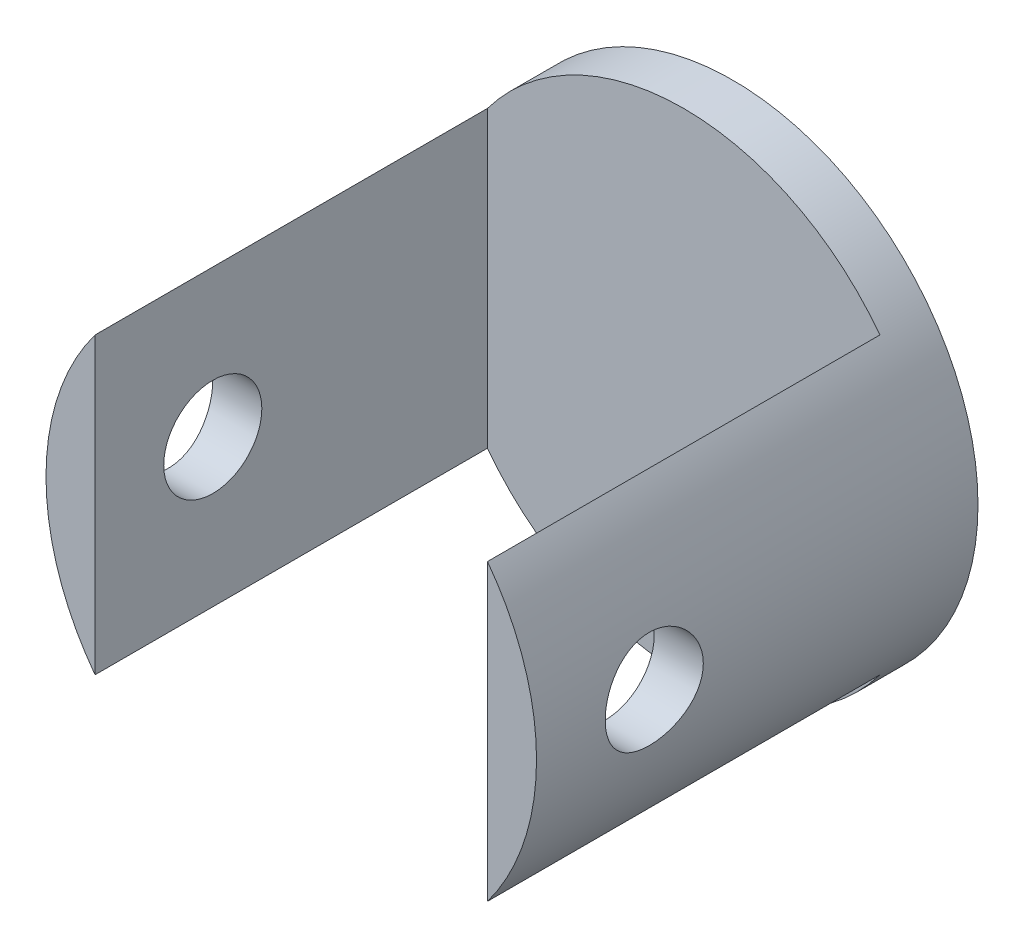
ISO-10303-21;
HEADER;
FILE_DESCRIPTION(('STEP AP214'),'2;1');
FILE_NAME('part.step','',(''),(''),'','','');
FILE_SCHEMA(('AUTOMOTIVE_DESIGN { 1 0 10303 214 1 1 1 1 }'));
ENDSEC;
DATA;
#1=APPLICATION_CONTEXT('core data for automotive mechanical design processes');
#2=APPLICATION_PROTOCOL_DEFINITION('international standard','automotive_design',2000,#1);
#3=PRODUCT_CONTEXT('',#1,'mechanical');
#4=PRODUCT('Part','Part','',(#3));
#5=PRODUCT_RELATED_PRODUCT_CATEGORY('part','',(#4));
#6=PRODUCT_DEFINITION_FORMATION('','',#4);
#7=PRODUCT_DEFINITION_CONTEXT('part definition',#1,'design');
#8=PRODUCT_DEFINITION('design','',#6,#7);
#9=PRODUCT_DEFINITION_SHAPE('','',#8);
#10=(LENGTH_UNIT() NAMED_UNIT(*) SI_UNIT(.MILLI.,.METRE.));
#11=(NAMED_UNIT(*) PLANE_ANGLE_UNIT() SI_UNIT($,.RADIAN.));
#12=(NAMED_UNIT(*) SI_UNIT($,.STERADIAN.) SOLID_ANGLE_UNIT());
#13=UNCERTAINTY_MEASURE_WITH_UNIT(LENGTH_MEASURE(1.E-05),#10,'distance_accuracy_value','');
#14=(GEOMETRIC_REPRESENTATION_CONTEXT(3) GLOBAL_UNCERTAINTY_ASSIGNED_CONTEXT((#13)) GLOBAL_UNIT_ASSIGNED_CONTEXT((#10,
#11,#12)) REPRESENTATION_CONTEXT('',''));
#15=CARTESIAN_POINT('',(0.,0.,0.));
#16=DIRECTION('',(0.,0.,1.));
#17=DIRECTION('',(1.,0.,0.));
#18=AXIS2_PLACEMENT_3D('',#15,#16,#17);
#19=CARTESIAN_POINT('',(0.,0.,45.));
#20=DIRECTION('',(0.,0.,1.));
#21=DIRECTION('',(1.,0.,0.));
#22=AXIS2_PLACEMENT_3D('',#19,#20,#21);
#23=PLANE('',#22);
#24=DIRECTION('',(0.,1.,0.));
#25=VECTOR('',#24,1.);
#26=CARTESIAN_POINT('',(20.,15.,45.));
#27=LINE('',#26,#25);
#28=CARTESIAN_POINT('',(20.,-15.,45.));
#29=VERTEX_POINT('',#28);
#30=CARTESIAN_POINT('',(20.,15.,45.));
#31=VERTEX_POINT('',#30);
#32=EDGE_CURVE('E74',#29,#31,#27,.T.);
#33=ORIENTED_EDGE('',*,*,#32,.F.);
#34=CARTESIAN_POINT('',(0.,0.,45.));
#35=DIRECTION('',(0.,0.,1.));
#36=DIRECTION('',(1.,0.,0.));
#37=AXIS2_PLACEMENT_3D('',#34,#35,#36);
#38=CIRCLE('',#37,25.);
#39=EDGE_CURVE('E111',#29,#31,#38,.T.);
#40=ORIENTED_EDGE('',*,*,#39,.T.);
#41=EDGE_LOOP('',(#33,#40));
#42=FACE_BOUND('',#41,.T.);
#43=ADVANCED_FACE('F34',(#42),#23,.T.);
#44=CARTESIAN_POINT('',(0.,0.,45.));
#45=DIRECTION('',(0.,0.,-1.));
#46=DIRECTION('',(-1.,0.,0.));
#47=AXIS2_PLACEMENT_3D('',#44,#45,#46);
#48=CYLINDRICAL_SURFACE('',#47,25.);
#49=CARTESIAN_POINT('',(-25.,0.,28.));
#50=CARTESIAN_POINT('',(-25.0000014065203,0.13898749378732,27.9999972305537));
#51=CARTESIAN_POINT('',(-24.9988389427216,0.277940302046084,28.0057967507189));
#52=CARTESIAN_POINT('',(-24.994224565157,0.554886864496201,28.0289436487026));
#53=CARTESIAN_POINT('',(-24.9907722194715,0.692880432791915,28.0462932051025));
#54=CARTESIAN_POINT('',(-24.981670242636,0.966937148503877,28.0924185622878));
#55=CARTESIAN_POINT('',(-24.9760194978176,1.10299928122357,28.1212001544859));
#56=CARTESIAN_POINT('',(-24.9626762565998,1.37221108352447,28.189974650891));
#57=CARTESIAN_POINT('',(-24.9549830097359,1.50535966309261,28.2299716762223));
#58=CARTESIAN_POINT('',(-24.9377804442932,1.76758319373794,28.3208037477418));
#59=CARTESIAN_POINT('',(-24.9282735779222,1.896663374225,28.3716241702152));
#60=CARTESIAN_POINT('',(-24.9076944208426,2.15009997814348,28.4837759821877));
#61=CARTESIAN_POINT('',(-24.8966215531404,2.2744546389337,28.5451112476588));
#62=CARTESIAN_POINT('',(-24.8732206370355,2.51749782000809,28.6778054307094));
#63=CARTESIAN_POINT('',(-24.8608931515555,2.63618884664851,28.7491598582939));
#64=CARTESIAN_POINT('',(-24.8353088041128,2.86722020463685,28.9014396352477));
#65=CARTESIAN_POINT('',(-24.8220515959613,2.97955814193968,28.9823685575353));
#66=CARTESIAN_POINT('',(-24.7948114657324,3.19837853881429,29.1542288068298));
#67=CARTESIAN_POINT('',(-24.780821838943,3.30477652475172,29.2452666433542));
#68=CARTESIAN_POINT('',(-24.7526457290753,3.50958996762925,29.4359623320355));
#69=CARTESIAN_POINT('',(-24.738459174971,3.60800245195942,29.5356233659181));
#70=CARTESIAN_POINT('',(-24.7102933832022,3.7961092760484,29.7428344359261));
#71=CARTESIAN_POINT('',(-24.6963140869323,3.88580612172819,29.8503821887634));
#72=CARTESIAN_POINT('',(-24.6689453876667,4.05592901668139,30.0727071654576));
#73=CARTESIAN_POINT('',(-24.6555562041458,4.13635163435981,30.1874870411645));
#74=CARTESIAN_POINT('',(-24.6296394657581,4.28798741229219,30.4245158431495));
#75=CARTESIAN_POINT('',(-24.6171204770982,4.35911381454494,30.5468213449877));
#76=CARTESIAN_POINT('',(-24.5934353082732,4.49081269831452,30.7971287471235));
#77=CARTESIAN_POINT('',(-24.5822696361062,4.55138122040543,30.9251327619876));
#78=CARTESIAN_POINT('',(-24.5513304070068,4.71644727257975,31.3162583561428));
#79=CARTESIAN_POINT('',(-24.5340820165952,4.80448882604819,31.5867806753944));
#80=CARTESIAN_POINT('',(-24.508635793463,4.9326478026569,32.1354614347939));
#81=CARTESIAN_POINT('',(-24.5003223072134,4.97337819482264,32.4134733297069));
#82=CARTESIAN_POINT('',(-24.4933199482487,5.00775493418215,32.972538498876));
#83=CARTESIAN_POINT('',(-24.4946300913956,5.00140609582257,33.2535914592096));
#84=CARTESIAN_POINT('',(-24.5066272442008,4.94227436036826,33.8062367199285));
#85=CARTESIAN_POINT('',(-24.5171725589932,4.89019310186595,34.0779077731742));
#86=CARTESIAN_POINT('',(-24.546227391949,4.74218902244969,34.6085796382417));
#87=CARTESIAN_POINT('',(-24.5647372904543,4.64626410780486,34.8675798443199));
#88=CARTESIAN_POINT('',(-24.6077809023025,4.41262402680006,35.3675765101468));
#89=CARTESIAN_POINT('',(-24.632354484594,4.27463078523214,35.6084394519075));
#90=CARTESIAN_POINT('',(-24.684730944745,3.96096784378848,36.0638541957962));
#91=CARTESIAN_POINT('',(-24.7125341935642,3.78529381392921,36.278402969647));
#92=CARTESIAN_POINT('',(-24.7688510603976,3.39749968079915,36.6791470271563));
#93=CARTESIAN_POINT('',(-24.797368460096,3.18478080820446,36.8647628432865));
#94=CARTESIAN_POINT('',(-24.8514424361697,2.73092511816778,37.1977692275152));
#95=CARTESIAN_POINT('',(-24.8769989745701,2.48978793632425,37.345159305376));
#96=CARTESIAN_POINT('',(-24.9223345079227,1.98529693496817,37.5976375472235));
#97=CARTESIAN_POINT('',(-24.9421044423773,1.72190909807364,37.7026594685971));
#98=CARTESIAN_POINT('',(-24.9735704494292,1.18074488209619,37.8668023698185));
#99=CARTESIAN_POINT('',(-24.98526750005,0.902970250347194,37.9259289099642));
#100=CARTESIAN_POINT('',(-24.9991335933204,0.345897028150543,37.9957822693686));
#101=CARTESIAN_POINT('',(-25.0014587325673,0.0667016415443166,38.0073020989149));
#102=CARTESIAN_POINT('',(-24.9967525965614,-0.489624670880023,37.9837507040756));
#103=CARTESIAN_POINT('',(-24.9897218472742,-0.766755711869972,37.9486820987804));
#104=CARTESIAN_POINT('',(-24.9671916002008,-1.30852830007857,37.8336081366968));
#105=CARTESIAN_POINT('',(-24.9517688194687,-1.57325974299468,37.7540096739056));
#106=CARTESIAN_POINT('',(-24.9141776037933,-2.08561813620307,37.5525800703246));
#107=CARTESIAN_POINT('',(-24.892008663478,-2.33324380335236,37.4307457654451));
#108=CARTESIAN_POINT('',(-24.8429955738642,-2.80770587332563,37.146587608663));
#109=CARTESIAN_POINT('',(-24.8160975113418,-3.03425065213175,36.9837863271994));
#110=CARTESIAN_POINT('',(-24.760736752006,-3.45709007722326,36.6229538115445));
#111=CARTESIAN_POINT('',(-24.7322738876682,-3.65338147605436,36.4249188002073));
#112=CARTESIAN_POINT('',(-24.6764651380018,-4.01320302351496,35.9956341215523));
#113=CARTESIAN_POINT('',(-24.6491428619003,-4.17618877400405,35.7639245902051));
#114=CARTESIAN_POINT('',(-24.5992097395686,-4.46092683850574,35.2759398820373));
#115=CARTESIAN_POINT('',(-24.5765987048474,-4.58268080227279,35.0196656886174));
#116=CARTESIAN_POINT('',(-24.5388364729789,-4.78076018011429,34.4911710677462));
#117=CARTESIAN_POINT('',(-24.5236466726876,-4.85732111853824,34.219041582143));
#118=CARTESIAN_POINT('',(-24.5023739077135,-4.96353963899985,33.6652869504155));
#119=CARTESIAN_POINT('',(-24.4962897554484,-4.9932033375265,33.3836630474779));
#120=CARTESIAN_POINT('',(-24.4945288792509,-5.00179339144585,32.9633296110449));
#121=CARTESIAN_POINT('',(-24.4951330184965,-4.99885021968412,32.8247734318508));
#122=CARTESIAN_POINT('',(-24.4986714739674,-4.98148651470878,32.5484262042855));
#123=CARTESIAN_POINT('',(-24.5016049058833,-4.9670703371849,32.4106348855248));
#124=CARTESIAN_POINT('',(-24.5097212135577,-4.92686276339316,32.1367509840809));
#125=CARTESIAN_POINT('',(-24.5149048765081,-4.9010673863209,32.0006590130313));
#126=CARTESIAN_POINT('',(-24.5273664043086,-4.83831799577185,31.7312200942603));
#127=CARTESIAN_POINT('',(-24.5346435219816,-4.80136796328246,31.5978721853161));
#128=CARTESIAN_POINT('',(-24.5510651803018,-4.71667811844351,31.3350772994335));
#129=CARTESIAN_POINT('',(-24.5602057877658,-4.66896100938055,31.2056227546989));
#130=CARTESIAN_POINT('',(-24.5800998692381,-4.56306801677477,30.9512483035948));
#131=CARTESIAN_POINT('',(-24.5908527723703,-4.5048958336854,30.8263268115449));
#132=CARTESIAN_POINT('',(-24.6136768592635,-4.37847423732261,30.5817524372729));
#133=CARTESIAN_POINT('',(-24.6257485895239,-4.31022064232977,30.462101768228));
#134=CARTESIAN_POINT('',(-24.6508678052533,-4.1641570153785,30.2289507545054));
#135=CARTESIAN_POINT('',(-24.6639149552593,-4.08635026305034,30.1154483182975));
#136=CARTESIAN_POINT('',(-24.6908640955351,-3.92025868558203,29.8933732647013));
#137=CARTESIAN_POINT('',(-24.7047769949563,-3.83181538764857,29.7849204602928));
#138=CARTESIAN_POINT('',(-24.7328525343466,-3.64620484015059,29.575861703643));
#139=CARTESIAN_POINT('',(-24.7470150848702,-3.54904066604526,29.4752530083459));
#140=CARTESIAN_POINT('',(-24.7752095204235,-3.34655721556743,29.2824593791969));
#141=CARTESIAN_POINT('',(-24.7892413231228,-3.24123314471885,29.1902794682239));
#142=CARTESIAN_POINT('',(-24.8167717117019,-3.02322778921367,29.0150730599733));
#143=CARTESIAN_POINT('',(-24.8302704919035,-2.91054922625043,28.932043206753));
#144=CARTESIAN_POINT('',(-24.8565085935593,-2.67729343786965,28.7748261028849));
#145=CARTESIAN_POINT('',(-24.869238066002,-2.55664367436167,28.7007447689402));
#146=CARTESIAN_POINT('',(-24.8934104051449,-2.30944481023434,28.5630556647833));
#147=CARTESIAN_POINT('',(-24.9048537437938,-2.18289789785573,28.4994440486864));
#148=CARTESIAN_POINT('',(-24.9261268452451,-1.9248233263731,28.3831754964997));
#149=CARTESIAN_POINT('',(-24.9359575839567,-1.79329873940675,28.3305119296995));
#150=CARTESIAN_POINT('',(-24.9537310452209,-1.52618442476761,28.236512319287));
#151=CARTESIAN_POINT('',(-24.9616741314688,-1.39059548585458,28.1951740933791));
#152=CARTESIAN_POINT('',(-24.9788087281562,-1.04920215690347,28.1067768728026));
#153=CARTESIAN_POINT('',(-24.9867141903289,-0.841457494405881,28.0667901892845));
#154=CARTESIAN_POINT('',(-24.9973086745575,-0.422448453280693,28.0134042805812));
#155=CARTESIAN_POINT('',(-24.9999978628663,-0.211184187046267,28.0000042080281));
#156=CARTESIAN_POINT('',(-25.,0.,28.));
#157=B_SPLINE_CURVE_WITH_KNOTS('',3,(#49,#50,#51,#52,#53,#54,#55,#56,#57,#58,#59,#60,#61,#62,
#63,#64,#65,#66,#67,#68,#69,#70,#71,#72,#73,#74,#75,#76,#77,#78,#79,#80,#81,#82,#83,#84,#85,#86,
#87,#88,#89,#90,#91,#92,#93,#94,#95,#96,#97,#98,#99,#100,#101,#102,#103,#104,#105,#106,#107,
#108,#109,#110,#111,#112,#113,#114,#115,#116,#117,#118,#119,#120,#121,#122,#123,#124,#125,#126,
#127,#128,#129,#130,#131,#132,#133,#134,#135,#136,#137,#138,#139,#140,#141,#142,#143,#144,#145,
#146,#147,#148,#149,#150,#151,#152,#153,#154,#155,#156),.UNSPECIFIED.,.T.,.F.,(4,2,2,2,2,2,2,2,
2,2,2,2,2,2,2,2,2,2,2,2,2,2,2,2,2,2,2,2,2,2,2,2,2,2,2,2,2,2,2,2,2,2,2,2,2,2,2,2,2,2,2,2,2,4),
(0.,0.416777047445418,0.833632730149863,1.25069985977206,1.66792044248879,2.08458084615619,
2.50139517036217,2.91802329572164,3.33480738770838,3.75649664408719,4.17834216132243,
4.60006602836891,5.02194544187045,5.44751701120412,5.87324783701269,6.72369555497643,
7.56299734191928,8.40221330082506,9.22877443707772,10.0553750494503,10.8875625969434,
11.7198458242473,12.5671007113313,13.4143664637548,14.262951829465,15.1114343716656,
15.9457248705771,16.7799684696572,17.6067107843,18.4335150475649,19.2704413884317,
20.1074575040603,20.9572195157251,21.8069475229371,22.652207138419,23.4973565033242,
23.9127168808878,24.3279196434016,24.7432677723233,25.1584678424529,25.5728004765726,
25.9869867501795,26.4013453111814,26.8155620171985,27.2369706991647,27.6582313488923,
28.0797414220244,28.5010963808509,28.9270309561325,29.3528087202144,29.7783278548953,
30.203764937947,30.8370559265658,31.4703267306209),.UNSPECIFIED.);
#158=CARTESIAN_POINT('',(-25.,0.,28.));
#159=VERTEX_POINT('',#158);
#160=EDGE_CURVE('E128',#159,#159,#157,.T.);
#161=ORIENTED_EDGE('',*,*,#160,.T.);
#162=EDGE_LOOP('',(#161));
#163=FACE_BOUND('',#162,.T.);
#164=CARTESIAN_POINT('',(25.,0.,28.));
#165=CARTESIAN_POINT('',(25.0000014065203,-0.138987493787324,27.9999972305537));
#166=CARTESIAN_POINT('',(24.9988389427216,-0.277940302046087,28.0057967507189));
#167=CARTESIAN_POINT('',(24.994224565157,-0.554886864496204,28.0289436487026));
#168=CARTESIAN_POINT('',(24.9907722194715,-0.692880432791918,28.0462932051025));
#169=CARTESIAN_POINT('',(24.981670242636,-0.96693714850388,28.0924185622878));
#170=CARTESIAN_POINT('',(24.9760194978176,-1.10299928122357,28.1212001544859));
#171=CARTESIAN_POINT('',(24.9626762565998,-1.37221108352448,28.189974650891));
#172=CARTESIAN_POINT('',(24.9549830097359,-1.50535966309261,28.2299716762223));
#173=CARTESIAN_POINT('',(24.9377804442932,-1.76758319373794,28.3208037477418));
#174=CARTESIAN_POINT('',(24.9282735779222,-1.896663374225,28.3716241702152));
#175=CARTESIAN_POINT('',(24.9076944208426,-2.15009997814348,28.4837759821877));
#176=CARTESIAN_POINT('',(24.8966215531404,-2.2744546389337,28.5451112476588));
#177=CARTESIAN_POINT('',(24.8732206370355,-2.51749782000809,28.6778054307094));
#178=CARTESIAN_POINT('',(24.8608931515555,-2.63618884664851,28.7491598582939));
#179=CARTESIAN_POINT('',(24.8353088041128,-2.86722020463685,28.9014396352477));
#180=CARTESIAN_POINT('',(24.8220515959613,-2.97955814193968,28.9823685575353));
#181=CARTESIAN_POINT('',(24.7948114657324,-3.1983785388143,29.1542288068298));
#182=CARTESIAN_POINT('',(24.780821838943,-3.30477652475172,29.2452666433542));
#183=CARTESIAN_POINT('',(24.7526457290753,-3.50958996762925,29.4359623320355));
#184=CARTESIAN_POINT('',(24.738459174971,-3.60800245195942,29.5356233659181));
#185=CARTESIAN_POINT('',(24.7102933832022,-3.79610927604841,29.7428344359261));
#186=CARTESIAN_POINT('',(24.6963140869323,-3.88580612172819,29.8503821887634));
#187=CARTESIAN_POINT('',(24.6689453876667,-4.05592901668139,30.0727071654576));
#188=CARTESIAN_POINT('',(24.6555562041458,-4.13635163435981,30.1874870411645));
#189=CARTESIAN_POINT('',(24.6296394657581,-4.28798741229219,30.4245158431495));
#190=CARTESIAN_POINT('',(24.6171204770982,-4.35911381454495,30.5468213449877));
#191=CARTESIAN_POINT('',(24.5934353082732,-4.49081269831453,30.7971287471235));
#192=CARTESIAN_POINT('',(24.5822696361062,-4.55138122040544,30.9251327619876));
#193=CARTESIAN_POINT('',(24.5513304070068,-4.71644727257975,31.3162583561428));
#194=CARTESIAN_POINT('',(24.5340820165952,-4.8044888260482,31.5867806753944));
#195=CARTESIAN_POINT('',(24.508635793463,-4.93264780265691,32.1354614347939));
#196=CARTESIAN_POINT('',(24.5003223072134,-4.97337819482265,32.4134733297069));
#197=CARTESIAN_POINT('',(24.4933199482487,-5.00775493418216,32.972538498876));
#198=CARTESIAN_POINT('',(24.4946300913956,-5.00140609582258,33.2535914592096));
#199=CARTESIAN_POINT('',(24.5066272442008,-4.94227436036827,33.8062367199285));
#200=CARTESIAN_POINT('',(24.5171725589932,-4.89019310186595,34.0779077731742));
#201=CARTESIAN_POINT('',(24.546227391949,-4.7421890224497,34.6085796382417));
#202=CARTESIAN_POINT('',(24.5647372904543,-4.64626410780487,34.8675798443199));
#203=CARTESIAN_POINT('',(24.6077809023025,-4.41262402680007,35.3675765101468));
#204=CARTESIAN_POINT('',(24.632354484594,-4.27463078523215,35.6084394519075));
#205=CARTESIAN_POINT('',(24.684730944745,-3.96096784378849,36.0638541957962));
#206=CARTESIAN_POINT('',(24.7125341935642,-3.78529381392922,36.278402969647));
#207=CARTESIAN_POINT('',(24.7688510603976,-3.39749968079916,36.6791470271563));
#208=CARTESIAN_POINT('',(24.797368460096,-3.18478080820447,36.8647628432865));
#209=CARTESIAN_POINT('',(24.8514424361697,-2.73092511816779,37.1977692275152));
#210=CARTESIAN_POINT('',(24.8769989745701,-2.48978793632427,37.345159305376));
#211=CARTESIAN_POINT('',(24.9223345079227,-1.98529693496819,37.5976375472235));
#212=CARTESIAN_POINT('',(24.9421044423773,-1.72190909807366,37.7026594685971));
#213=CARTESIAN_POINT('',(24.9735704494292,-1.1807448820962,37.8668023698185));
#214=CARTESIAN_POINT('',(24.98526750005,-0.902970250347207,37.9259289099642));
#215=CARTESIAN_POINT('',(24.9991335933204,-0.345897028150556,37.9957822693686));
#216=CARTESIAN_POINT('',(25.0014587325673,-0.0667016415443303,38.0073020989149));
#217=CARTESIAN_POINT('',(24.9967525965614,0.489624670880009,37.9837507040756));
#218=CARTESIAN_POINT('',(24.9897218472742,0.766755711869958,37.9486820987804));
#219=CARTESIAN_POINT('',(24.9671916002008,1.30852830007856,37.8336081366968));
#220=CARTESIAN_POINT('',(24.9517688194687,1.57325974299467,37.7540096739056));
#221=CARTESIAN_POINT('',(24.9141776037933,2.08561813620306,37.5525800703246));
#222=CARTESIAN_POINT('',(24.892008663478,2.33324380335235,37.4307457654451));
#223=CARTESIAN_POINT('',(24.8429955738642,2.80770587332561,37.146587608663));
#224=CARTESIAN_POINT('',(24.8160975113418,3.03425065213174,36.9837863271994));
#225=CARTESIAN_POINT('',(24.760736752006,3.45709007722325,36.6229538115445));
#226=CARTESIAN_POINT('',(24.7322738876682,3.65338147605435,36.4249188002073));
#227=CARTESIAN_POINT('',(24.6764651380018,4.01320302351495,35.9956341215523));
#228=CARTESIAN_POINT('',(24.6491428619003,4.17618877400404,35.7639245902051));
#229=CARTESIAN_POINT('',(24.5992097395686,4.46092683850573,35.2759398820373));
#230=CARTESIAN_POINT('',(24.5765987048474,4.58268080227278,35.0196656886174));
#231=CARTESIAN_POINT('',(24.5388364729789,4.78076018011429,34.4911710677462));
#232=CARTESIAN_POINT('',(24.5236466726876,4.85732111853823,34.2190415821429));
#233=CARTESIAN_POINT('',(24.5023739077135,4.96353963899985,33.6652869504155));
#234=CARTESIAN_POINT('',(24.4962897554484,4.99320333752649,33.3836630474779));
#235=CARTESIAN_POINT('',(24.4945288792509,5.00179339144584,32.9633296110449));
#236=CARTESIAN_POINT('',(24.4951330184965,4.99885021968411,32.8247734318508));
#237=CARTESIAN_POINT('',(24.4986714739674,4.98148651470878,32.5484262042855));
#238=CARTESIAN_POINT('',(24.5016049058833,4.9670703371849,32.4106348855248));
#239=CARTESIAN_POINT('',(24.5097212135577,4.92686276339316,32.1367509840809));
#240=CARTESIAN_POINT('',(24.5149048765081,4.90106738632089,32.0006590130313));
#241=CARTESIAN_POINT('',(24.5273664043086,4.83831799577184,31.7312200942603));
#242=CARTESIAN_POINT('',(24.5346435219816,4.80136796328246,31.5978721853161));
#243=CARTESIAN_POINT('',(24.5510651803018,4.71667811844351,31.3350772994335));
#244=CARTESIAN_POINT('',(24.5602057877658,4.66896100938054,31.205622754699));
#245=CARTESIAN_POINT('',(24.5800998692381,4.56306801677477,30.9512483035948));
#246=CARTESIAN_POINT('',(24.5908527723703,4.5048958336854,30.826326811545));
#247=CARTESIAN_POINT('',(24.6136768592635,4.37847423732261,30.5817524372729));
#248=CARTESIAN_POINT('',(24.6257485895239,4.31022064232977,30.462101768228));
#249=CARTESIAN_POINT('',(24.6508678052533,4.1641570153785,30.2289507545054));
#250=CARTESIAN_POINT('',(24.6639149552593,4.08635026305033,30.1154483182975));
#251=CARTESIAN_POINT('',(24.6908640955351,3.92025868558202,29.8933732647013));
#252=CARTESIAN_POINT('',(24.7047769949563,3.83181538764857,29.7849204602928));
#253=CARTESIAN_POINT('',(24.7328525343466,3.64620484015059,29.575861703643));
#254=CARTESIAN_POINT('',(24.7470150848702,3.54904066604526,29.4752530083459));
#255=CARTESIAN_POINT('',(24.7752095204235,3.34655721556743,29.282459379197));
#256=CARTESIAN_POINT('',(24.7892413231228,3.24123314471885,29.1902794682239));
#257=CARTESIAN_POINT('',(24.8167717117019,3.02322778921367,29.0150730599733));
#258=CARTESIAN_POINT('',(24.8302704919035,2.91054922625043,28.932043206753));
#259=CARTESIAN_POINT('',(24.8565085935593,2.67729343786964,28.7748261028849));
#260=CARTESIAN_POINT('',(24.869238066002,2.55664367436167,28.7007447689402));
#261=CARTESIAN_POINT('',(24.8934104051449,2.30944481023433,28.5630556647833));
#262=CARTESIAN_POINT('',(24.9048537437938,2.18289789785573,28.4994440486864));
#263=CARTESIAN_POINT('',(24.9261268452451,1.9248233263731,28.3831754964997));
#264=CARTESIAN_POINT('',(24.9359575839567,1.79329873940675,28.3305119296995));
#265=CARTESIAN_POINT('',(24.9537310452209,1.5261844247676,28.236512319287));
#266=CARTESIAN_POINT('',(24.9616741314688,1.39059548585458,28.1951740933791));
#267=CARTESIAN_POINT('',(24.9788087281562,1.04920215690347,28.1067768728026));
#268=CARTESIAN_POINT('',(24.9867141903289,0.841457494405879,28.0667901892845));
#269=CARTESIAN_POINT('',(24.9973086745575,0.42244845328069,28.0134042805812));
#270=CARTESIAN_POINT('',(24.9999978628663,0.211184187046264,28.0000042080281));
#271=CARTESIAN_POINT('',(25.,0.,28.));
#272=B_SPLINE_CURVE_WITH_KNOTS('',3,(#164,#165,#166,#167,#168,#169,#170,#171,#172,#173,#174,
#175,#176,#177,#178,#179,#180,#181,#182,#183,#184,#185,#186,#187,#188,#189,#190,#191,#192,#193,
#194,#195,#196,#197,#198,#199,#200,#201,#202,#203,#204,#205,#206,#207,#208,#209,#210,#211,#212,
#213,#214,#215,#216,#217,#218,#219,#220,#221,#222,#223,#224,#225,#226,#227,#228,#229,#230,#231,
#232,#233,#234,#235,#236,#237,#238,#239,#240,#241,#242,#243,#244,#245,#246,#247,#248,#249,#250,
#251,#252,#253,#254,#255,#256,#257,#258,#259,#260,#261,#262,#263,#264,#265,#266,#267,#268,#269,
#270,#271),.UNSPECIFIED.,.T.,.F.,(4,2,2,2,2,2,2,2,2,2,2,2,2,2,2,2,2,2,2,2,2,2,2,2,2,2,2,2,2,2,2,
2,2,2,2,2,2,2,2,2,2,2,2,2,2,2,2,2,2,2,2,2,2,4),(0.,0.416777047445417,0.833632730149863,
1.25069985977206,1.66792044248879,2.08458084615619,2.50139517036217,2.91802329572164,
3.33480738770838,3.75649664408719,4.17834216132243,4.6000660283689,5.02194544187045,
5.44751701120413,5.87324783701269,6.72369555497643,7.56299734191929,8.40221330082506,
9.22877443707773,10.0553750494503,10.8875625969434,11.7198458242473,12.5671007113313,
13.4143664637548,14.262951829465,15.1114343716656,15.9457248705771,16.7799684696572,
17.6067107843,18.4335150475649,19.2704413884317,20.1074575040603,20.9572195157251,
21.8069475229371,22.652207138419,23.4973565033242,23.9127168808878,24.3279196434016,
24.7432677723233,25.1584678424529,25.5728004765726,25.9869867501795,26.4013453111813,
26.8155620171985,27.2369706991647,27.6582313488923,28.0797414220244,28.5010963808509,
28.9270309561325,29.3528087202144,29.7783278548953,30.203764937947,30.8370559265658,
31.4703267306209),.UNSPECIFIED.);
#273=CARTESIAN_POINT('',(25.,0.,28.));
#274=VERTEX_POINT('',#273);
#275=EDGE_CURVE('E135',#274,#274,#272,.T.);
#276=ORIENTED_EDGE('',*,*,#275,.T.);
#277=EDGE_LOOP('',(#276));
#278=FACE_BOUND('',#277,.T.);
#279=CARTESIAN_POINT('',(0.,0.,5.));
#280=DIRECTION('',(0.,0.,1.));
#281=DIRECTION('',(1.,0.,0.));
#282=AXIS2_PLACEMENT_3D('',#279,#280,#281);
#283=CIRCLE('',#282,25.);
#284=CARTESIAN_POINT('',(20.,15.,5.));
#285=VERTEX_POINT('',#284);
#286=CARTESIAN_POINT('',(-20.,15.,5.));
#287=VERTEX_POINT('',#286);
#288=EDGE_CURVE('E94',#285,#287,#283,.T.);
#289=ORIENTED_EDGE('',*,*,#288,.F.);
#290=DIRECTION('',(0.,0.,1.));
#291=VECTOR('',#290,1.);
#292=CARTESIAN_POINT('',(20.,15.,5.));
#293=LINE('',#292,#291);
#294=EDGE_CURVE('E60',#285,#31,#293,.T.);
#295=ORIENTED_EDGE('',*,*,#294,.T.);
#296=ORIENTED_EDGE('',*,*,#39,.F.);
#297=DIRECTION('',(0.,0.,1.));
#298=VECTOR('',#297,1.);
#299=CARTESIAN_POINT('',(20.,-15.,5.));
#300=LINE('',#299,#298);
#301=CARTESIAN_POINT('',(20.,-15.,5.));
#302=VERTEX_POINT('',#301);
#303=EDGE_CURVE('E88',#302,#29,#300,.T.);
#304=ORIENTED_EDGE('',*,*,#303,.F.);
#305=CARTESIAN_POINT('',(0.,0.,5.));
#306=DIRECTION('',(0.,0.,1.));
#307=DIRECTION('',(1.,0.,0.));
#308=AXIS2_PLACEMENT_3D('',#305,#306,#307);
#309=CIRCLE('',#308,25.);
#310=CARTESIAN_POINT('',(-20.,-15.,5.));
#311=VERTEX_POINT('',#310);
#312=EDGE_CURVE('E92',#311,#302,#309,.T.);
#313=ORIENTED_EDGE('',*,*,#312,.F.);
#314=DIRECTION('',(0.,0.,1.));
#315=VECTOR('',#314,1.);
#316=CARTESIAN_POINT('',(-20.,-15.,5.));
#317=LINE('',#316,#315);
#318=CARTESIAN_POINT('',(-20.,-15.,45.));
#319=VERTEX_POINT('',#318);
#320=EDGE_CURVE('E81',#311,#319,#317,.T.);
#321=ORIENTED_EDGE('',*,*,#320,.T.);
#322=CARTESIAN_POINT('',(-20.,15.,45.));
#323=VERTEX_POINT('',#322);
#324=EDGE_CURVE('E114',#323,#319,#38,.T.);
#325=ORIENTED_EDGE('',*,*,#324,.F.);
#326=DIRECTION('',(0.,0.,1.));
#327=VECTOR('',#326,1.);
#328=CARTESIAN_POINT('',(-20.,15.,5.));
#329=LINE('',#328,#327);
#330=EDGE_CURVE('E51',#287,#323,#329,.T.);
#331=ORIENTED_EDGE('',*,*,#330,.F.);
#332=EDGE_LOOP('',(#289,#295,#296,#304,#313,#321,#325,#331));
#333=FACE_BOUND('',#332,.T.);
#334=CARTESIAN_POINT('',(0.,0.,0.));
#335=DIRECTION('',(0.,0.,1.));
#336=DIRECTION('',(1.,0.,0.));
#337=AXIS2_PLACEMENT_3D('',#334,#335,#336);
#338=CIRCLE('',#337,25.);
#339=CARTESIAN_POINT('',(25.,0.,0.));
#340=VERTEX_POINT('',#339);
#341=EDGE_CURVE('E108',#340,#340,#338,.T.);
#342=ORIENTED_EDGE('',*,*,#341,.T.);
#343=EDGE_LOOP('',(#342));
#344=FACE_BOUND('',#343,.T.);
#345=ADVANCED_FACE('F36',(#163,#278,#333,#344),#48,.T.);
#346=DIRECTION('',(0.,-1.,0.));
#347=VECTOR('',#346,1.);
#348=CARTESIAN_POINT('',(-20.,15.,45.));
#349=LINE('',#348,#347);
#350=EDGE_CURVE('E83',#323,#319,#349,.T.);
#351=ORIENTED_EDGE('',*,*,#350,.F.);
#352=ORIENTED_EDGE('',*,*,#324,.T.);
#353=EDGE_LOOP('',(#351,#352));
#354=FACE_BOUND('',#353,.T.);
#355=ADVANCED_FACE('F121',(#354),#23,.T.);
#356=CARTESIAN_POINT('',(0.,0.,0.));
#357=DIRECTION('',(0.,0.,1.));
#358=DIRECTION('',(1.,0.,0.));
#359=AXIS2_PLACEMENT_3D('',#356,#357,#358);
#360=PLANE('',#359);
#361=CARTESIAN_POINT('',(6.33,-7.66,0.));
#362=DIRECTION('',(0.,0.,1.));
#363=DIRECTION('',(1.,0.,0.));
#364=AXIS2_PLACEMENT_3D('',#361,#362,#363);
#365=CIRCLE('',#364,5.);
#366=CARTESIAN_POINT('',(11.33,-7.66,0.));
#367=VERTEX_POINT('',#366);
#368=EDGE_CURVE('E11',#367,#367,#365,.F.);
#369=ORIENTED_EDGE('',*,*,#368,.F.);
#370=EDGE_LOOP('',(#369));
#371=FACE_BOUND('',#370,.T.);
#372=CARTESIAN_POINT('',(-6.33,7.66,0.));
#373=DIRECTION('',(0.,0.,1.));
#374=DIRECTION('',(1.,0.,0.));
#375=AXIS2_PLACEMENT_3D('',#372,#373,#374);
#376=CIRCLE('',#375,5.);
#377=CARTESIAN_POINT('',(-1.33,7.66,0.));
#378=VERTEX_POINT('',#377);
#379=EDGE_CURVE('E44',#378,#378,#376,.F.);
#380=ORIENTED_EDGE('',*,*,#379,.F.);
#381=EDGE_LOOP('',(#380));
#382=FACE_BOUND('',#381,.T.);
#383=ORIENTED_EDGE('',*,*,#341,.F.);
#384=EDGE_LOOP('',(#383));
#385=FACE_BOUND('',#384,.T.);
#386=ADVANCED_FACE('F168',(#371,#382,#385),#360,.F.);
#387=CARTESIAN_POINT('',(20.,15.,5.));
#388=DIRECTION('',(1.,0.,0.));
#389=DIRECTION('',(0.,0.,-1.));
#390=AXIS2_PLACEMENT_3D('',#387,#388,#389);
#391=PLANE('',#390);
#392=CARTESIAN_POINT('',(20.,0.,33.));
#393=DIRECTION('',(1.,0.,0.));
#394=DIRECTION('',(0.,0.,-1.));
#395=AXIS2_PLACEMENT_3D('',#392,#393,#394);
#396=CIRCLE('',#395,5.);
#397=CARTESIAN_POINT('',(20.,0.,28.));
#398=VERTEX_POINT('',#397);
#399=EDGE_CURVE('E193',#398,#398,#396,.T.);
#400=ORIENTED_EDGE('',*,*,#399,.T.);
#401=EDGE_LOOP('',(#400));
#402=FACE_BOUND('',#401,.T.);
#403=ORIENTED_EDGE('',*,*,#32,.T.);
#404=ORIENTED_EDGE('',*,*,#294,.F.);
#405=DIRECTION('',(0.,1.,0.));
#406=VECTOR('',#405,1.);
#407=CARTESIAN_POINT('',(20.,15.,5.));
#408=LINE('',#407,#406);
#409=EDGE_CURVE('E99',#302,#285,#408,.T.);
#410=ORIENTED_EDGE('',*,*,#409,.F.);
#411=ORIENTED_EDGE('',*,*,#303,.T.);
#412=EDGE_LOOP('',(#403,#404,#410,#411));
#413=FACE_BOUND('',#412,.T.);
#414=ADVANCED_FACE('F165',(#402,#413),#391,.F.);
#415=CARTESIAN_POINT('',(-20.,15.,5.));
#416=DIRECTION('',(-1.,0.,0.));
#417=DIRECTION('',(0.,0.,1.));
#418=AXIS2_PLACEMENT_3D('',#415,#416,#417);
#419=PLANE('',#418);
#420=CARTESIAN_POINT('',(-20.,0.,33.));
#421=DIRECTION('',(-1.,0.,0.));
#422=DIRECTION('',(0.,0.,1.));
#423=AXIS2_PLACEMENT_3D('',#420,#421,#422);
#424=CIRCLE('',#423,5.);
#425=CARTESIAN_POINT('',(-20.,0.,38.));
#426=VERTEX_POINT('',#425);
#427=EDGE_CURVE('E39',#426,#426,#424,.T.);
#428=ORIENTED_EDGE('',*,*,#427,.T.);
#429=EDGE_LOOP('',(#428));
#430=FACE_BOUND('',#429,.T.);
#431=ORIENTED_EDGE('',*,*,#350,.T.);
#432=ORIENTED_EDGE('',*,*,#320,.F.);
#433=DIRECTION('',(0.,-1.,0.));
#434=VECTOR('',#433,1.);
#435=CARTESIAN_POINT('',(-20.,15.,5.));
#436=LINE('',#435,#434);
#437=EDGE_CURVE('E78',#287,#311,#436,.T.);
#438=ORIENTED_EDGE('',*,*,#437,.F.);
#439=ORIENTED_EDGE('',*,*,#330,.T.);
#440=EDGE_LOOP('',(#431,#432,#438,#439));
#441=FACE_BOUND('',#440,.T.);
#442=ADVANCED_FACE('F82',(#430,#441),#419,.F.);
#443=CARTESIAN_POINT('',(0.,0.,5.));
#444=DIRECTION('',(0.,0.,1.));
#445=DIRECTION('',(1.,0.,0.));
#446=AXIS2_PLACEMENT_3D('',#443,#444,#445);
#447=PLANE('',#446);
#448=ORIENTED_EDGE('',*,*,#288,.T.);
#449=ORIENTED_EDGE('',*,*,#437,.T.);
#450=ORIENTED_EDGE('',*,*,#312,.T.);
#451=ORIENTED_EDGE('',*,*,#409,.T.);
#452=EDGE_LOOP('',(#448,#449,#450,#451));
#453=FACE_BOUND('',#452,.T.);
#454=ADVANCED_FACE('F91',(#453),#447,.T.);
#455=CARTESIAN_POINT('',(-6.33,7.66,-2.));
#456=DIRECTION('',(0.,0.,1.));
#457=DIRECTION('',(1.,0.,0.));
#458=AXIS2_PLACEMENT_3D('',#455,#456,#457);
#459=CYLINDRICAL_SURFACE('',#458,5.);
#460=CARTESIAN_POINT('',(-6.33,7.66,-2.));
#461=DIRECTION('',(0.,0.,-1.));
#462=DIRECTION('',(-1.,0.,0.));
#463=AXIS2_PLACEMENT_3D('',#460,#461,#462);
#464=CIRCLE('',#463,5.);
#465=CARTESIAN_POINT('',(-11.33,7.66,-2.));
#466=VERTEX_POINT('',#465);
#467=EDGE_CURVE('E105',#466,#466,#464,.T.);
#468=ORIENTED_EDGE('',*,*,#467,.F.);
#469=EDGE_LOOP('',(#468));
#470=FACE_BOUND('',#469,.T.);
#471=ORIENTED_EDGE('',*,*,#379,.T.);
#472=EDGE_LOOP('',(#471));
#473=FACE_BOUND('',#472,.T.);
#474=ADVANCED_FACE('F158',(#470,#473),#459,.T.);
#475=CARTESIAN_POINT('',(-6.33,7.66,-2.));
#476=DIRECTION('',(0.,0.,-1.));
#477=DIRECTION('',(-1.,0.,0.));
#478=AXIS2_PLACEMENT_3D('',#475,#476,#477);
#479=PLANE('',#478);
#480=ORIENTED_EDGE('',*,*,#467,.T.);
#481=EDGE_LOOP('',(#480));
#482=FACE_BOUND('',#481,.T.);
#483=ADVANCED_FACE('F154',(#482),#479,.T.);
#484=CARTESIAN_POINT('',(6.33,-7.66,-2.));
#485=DIRECTION('',(0.,0.,1.));
#486=DIRECTION('',(1.,0.,0.));
#487=AXIS2_PLACEMENT_3D('',#484,#485,#486);
#488=CYLINDRICAL_SURFACE('',#487,5.);
#489=CARTESIAN_POINT('',(6.33,-7.66,-2.));
#490=DIRECTION('',(0.,0.,-1.));
#491=DIRECTION('',(-1.,0.,0.));
#492=AXIS2_PLACEMENT_3D('',#489,#490,#491);
#493=CIRCLE('',#492,5.);
#494=CARTESIAN_POINT('',(1.32999999999999,-7.66,-2.));
#495=VERTEX_POINT('',#494);
#496=EDGE_CURVE('E125',#495,#495,#493,.T.);
#497=ORIENTED_EDGE('',*,*,#496,.F.);
#498=EDGE_LOOP('',(#497));
#499=FACE_BOUND('',#498,.T.);
#500=ORIENTED_EDGE('',*,*,#368,.T.);
#501=EDGE_LOOP('',(#500));
#502=FACE_BOUND('',#501,.T.);
#503=ADVANCED_FACE('F150',(#499,#502),#488,.T.);
#504=CARTESIAN_POINT('',(6.33,-7.66,-2.));
#505=DIRECTION('',(0.,0.,-1.));
#506=DIRECTION('',(-1.,0.,0.));
#507=AXIS2_PLACEMENT_3D('',#504,#505,#506);
#508=PLANE('',#507);
#509=ORIENTED_EDGE('',*,*,#496,.T.);
#510=EDGE_LOOP('',(#509));
#511=FACE_BOUND('',#510,.T.);
#512=ADVANCED_FACE('F145',(#511),#508,.T.);
#513=CARTESIAN_POINT('',(-25.,0.,33.));
#514=DIRECTION('',(1.,0.,0.));
#515=DIRECTION('',(0.,0.,-1.));
#516=AXIS2_PLACEMENT_3D('',#513,#514,#515);
#517=CYLINDRICAL_SURFACE('',#516,5.);
#518=ORIENTED_EDGE('',*,*,#427,.F.);
#519=EDGE_LOOP('',(#518));
#520=FACE_BOUND('',#519,.T.);
#521=ORIENTED_EDGE('',*,*,#160,.F.);
#522=EDGE_LOOP('',(#521));
#523=FACE_BOUND('',#522,.T.);
#524=ADVANCED_FACE('F140',(#520,#523),#517,.F.);
#525=ORIENTED_EDGE('',*,*,#399,.F.);
#526=EDGE_LOOP('',(#525));
#527=FACE_BOUND('',#526,.T.);
#528=ORIENTED_EDGE('',*,*,#275,.F.);
#529=EDGE_LOOP('',(#528));
#530=FACE_BOUND('',#529,.T.);
#531=ADVANCED_FACE('F144',(#527,#530),#517,.F.);
#532=CLOSED_SHELL('',(#43,#345,#355,#386,#414,#442,#454,#474,#483,#503,#512,#524,#531));
#533=MANIFOLD_SOLID_BREP('B2',#532);
#534=ADVANCED_BREP_SHAPE_REPRESENTATION('',(#18,#533),#14);
#535=SHAPE_DEFINITION_REPRESENTATION(#9,#534);
ENDSEC;
END-ISO-10303-21;
